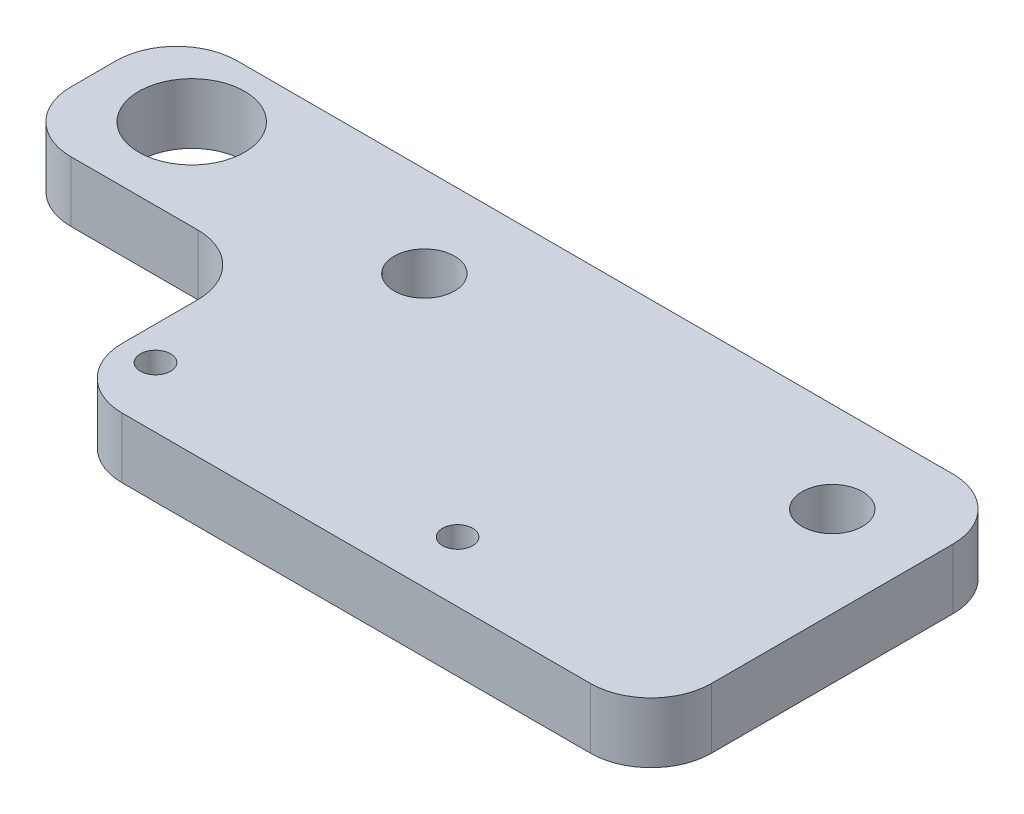
ISO-10303-21;
HEADER;
FILE_DESCRIPTION(('STEP AP214'),'2;1');
FILE_NAME('part.step','',(''),(''),'','','');
FILE_SCHEMA(('AUTOMOTIVE_DESIGN { 1 0 10303 214 1 1 1 1 }'));
ENDSEC;
DATA;
#1=APPLICATION_CONTEXT('core data for automotive mechanical design processes');
#2=APPLICATION_PROTOCOL_DEFINITION('international standard','automotive_design',2000,#1);
#3=PRODUCT_CONTEXT('',#1,'mechanical');
#4=PRODUCT('Part','Part','',(#3));
#5=PRODUCT_RELATED_PRODUCT_CATEGORY('part','',(#4));
#6=PRODUCT_DEFINITION_FORMATION('','',#4);
#7=PRODUCT_DEFINITION_CONTEXT('part definition',#1,'design');
#8=PRODUCT_DEFINITION('design','',#6,#7);
#9=PRODUCT_DEFINITION_SHAPE('','',#8);
#10=(LENGTH_UNIT() NAMED_UNIT(*) SI_UNIT(.MILLI.,.METRE.));
#11=(NAMED_UNIT(*) PLANE_ANGLE_UNIT() SI_UNIT($,.RADIAN.));
#12=(NAMED_UNIT(*) SI_UNIT($,.STERADIAN.) SOLID_ANGLE_UNIT());
#13=UNCERTAINTY_MEASURE_WITH_UNIT(LENGTH_MEASURE(1.E-05),#10,'distance_accuracy_value','');
#14=(GEOMETRIC_REPRESENTATION_CONTEXT(3) GLOBAL_UNCERTAINTY_ASSIGNED_CONTEXT((#13)) GLOBAL_UNIT_ASSIGNED_CONTEXT((#10,
#11,#12)) REPRESENTATION_CONTEXT('',''));
#15=CARTESIAN_POINT('',(0.,0.,0.));
#16=DIRECTION('',(0.,0.,1.));
#17=DIRECTION('',(1.,0.,0.));
#18=AXIS2_PLACEMENT_3D('',#15,#16,#17);
#19=CARTESIAN_POINT('',(0.,2.,0.));
#20=DIRECTION('',(0.,1.,0.));
#21=DIRECTION('',(0.,0.,1.));
#22=AXIS2_PLACEMENT_3D('',#19,#20,#21);
#23=PLANE('',#22);
#24=CARTESIAN_POINT('',(-1.76432653061225,2.,8.89754480085058));
#25=DIRECTION('',(0.,1.,0.));
#26=DIRECTION('',(0.,0.,1.));
#27=AXIS2_PLACEMENT_3D('',#24,#25,#26);
#28=CIRCLE('',#27,0.5);
#29=CARTESIAN_POINT('',(-1.76432653061225,2.,9.39754480085058));
#30=VERTEX_POINT('',#29);
#31=EDGE_CURVE('E299',#30,#30,#28,.T.);
#32=ORIENTED_EDGE('',*,*,#31,.F.);
#33=EDGE_LOOP('',(#32));
#34=FACE_BOUND('',#33,.T.);
#35=CARTESIAN_POINT('',(3.63567346938775,2.,1.89754480085059));
#36=DIRECTION('',(0.,1.,0.));
#37=DIRECTION('',(0.,0.,1.));
#38=AXIS2_PLACEMENT_3D('',#35,#36,#37);
#39=CIRCLE('',#38,0.999999999999998);
#40=CARTESIAN_POINT('',(3.63567346938775,2.,2.89754480085058));
#41=VERTEX_POINT('',#40);
#42=EDGE_CURVE('E285',#41,#41,#39,.T.);
#43=ORIENTED_EDGE('',*,*,#42,.F.);
#44=EDGE_LOOP('',(#43));
#45=FACE_BOUND('',#44,.T.);
#46=DIRECTION('',(-1.,0.,0.));
#47=VECTOR('',#46,1.);
#48=CARTESIAN_POINT('',(-12.8643265306123,2.,-1.10245519914941));
#49=LINE('',#48,#47);
#50=CARTESIAN_POINT('',(4.63567346938775,2.,-1.10245519914942));
#51=VERTEX_POINT('',#50);
#52=CARTESIAN_POINT('',(-19.0643265306122,2.,-1.10245519914941));
#53=VERTEX_POINT('',#52);
#54=EDGE_CURVE('E192',#51,#53,#49,.T.);
#55=ORIENTED_EDGE('',*,*,#54,.T.);
#56=CARTESIAN_POINT('',(-19.0643265306122,2.,0.897544800850586));
#57=DIRECTION('',(0.,1.,0.));
#58=DIRECTION('',(0.,0.,1.));
#59=AXIS2_PLACEMENT_3D('',#56,#57,#58);
#60=CIRCLE('',#59,2.);
#61=CARTESIAN_POINT('',(-21.0643265306122,2.,0.897544800850587));
#62=VERTEX_POINT('',#61);
#63=EDGE_CURVE('E221',#53,#62,#60,.T.);
#64=ORIENTED_EDGE('',*,*,#63,.T.);
#65=DIRECTION('',(0.,0.,1.));
#66=VECTOR('',#65,1.);
#67=CARTESIAN_POINT('',(-21.0643265306122,2.,-1.10245519914941));
#68=LINE('',#67,#66);
#69=CARTESIAN_POINT('',(-21.0643265306122,2.,2.39754480085059));
#70=VERTEX_POINT('',#69);
#71=EDGE_CURVE('E155',#62,#70,#68,.T.);
#72=ORIENTED_EDGE('',*,*,#71,.T.);
#73=CARTESIAN_POINT('',(-19.0643265306122,2.,2.39754480085059));
#74=DIRECTION('',(0.,1.,0.));
#75=DIRECTION('',(0.,0.,1.));
#76=AXIS2_PLACEMENT_3D('',#73,#74,#75);
#77=CIRCLE('',#76,2.);
#78=CARTESIAN_POINT('',(-19.0643265306122,2.,4.39754480085058));
#79=VERTEX_POINT('',#78);
#80=EDGE_CURVE('E218',#70,#79,#77,.T.);
#81=ORIENTED_EDGE('',*,*,#80,.T.);
#82=DIRECTION('',(1.,0.,0.));
#83=VECTOR('',#82,1.);
#84=CARTESIAN_POINT('',(-12.8643265306123,2.,4.39754480085058));
#85=LINE('',#84,#83);
#86=CARTESIAN_POINT('',(-14.8643265306123,2.,4.39754480085058));
#87=VERTEX_POINT('',#86);
#88=EDGE_CURVE('E268',#79,#87,#85,.T.);
#89=ORIENTED_EDGE('',*,*,#88,.T.);
#90=CARTESIAN_POINT('',(-14.8643265306123,2.,6.39754480085058));
#91=DIRECTION('',(0.,1.,0.));
#92=DIRECTION('',(0.,0.,1.));
#93=AXIS2_PLACEMENT_3D('',#90,#91,#92);
#94=CIRCLE('',#93,2.);
#95=CARTESIAN_POINT('',(-12.8643265306123,2.,6.39754480085058));
#96=VERTEX_POINT('',#95);
#97=EDGE_CURVE('E11',#87,#96,#94,.F.);
#98=ORIENTED_EDGE('',*,*,#97,.T.);
#99=DIRECTION('',(0.,0.,1.));
#100=VECTOR('',#99,1.);
#101=CARTESIAN_POINT('',(-12.8643265306123,2.,4.39754480085058));
#102=LINE('',#101,#100);
#103=CARTESIAN_POINT('',(-12.8643265306123,2.,8.89754480085059));
#104=VERTEX_POINT('',#103);
#105=EDGE_CURVE('E266',#96,#104,#102,.T.);
#106=ORIENTED_EDGE('',*,*,#105,.T.);
#107=CARTESIAN_POINT('',(-10.8643265306122,2.,8.89754480085059));
#108=DIRECTION('',(0.,1.,0.));
#109=DIRECTION('',(0.,0.,1.));
#110=AXIS2_PLACEMENT_3D('',#107,#108,#109);
#111=CIRCLE('',#110,2.);
#112=CARTESIAN_POINT('',(-10.8643265306122,2.,10.8975448008506));
#113=VERTEX_POINT('',#112);
#114=EDGE_CURVE('E210',#104,#113,#111,.T.);
#115=ORIENTED_EDGE('',*,*,#114,.T.);
#116=DIRECTION('',(1.,0.,0.));
#117=VECTOR('',#116,1.);
#118=CARTESIAN_POINT('',(-12.8643265306122,2.,10.8975448008506));
#119=LINE('',#118,#117);
#120=CARTESIAN_POINT('',(4.63567346938775,2.,10.8975448008506));
#121=VERTEX_POINT('',#120);
#122=EDGE_CURVE('E273',#113,#121,#119,.T.);
#123=ORIENTED_EDGE('',*,*,#122,.T.);
#124=CARTESIAN_POINT('',(4.63567346938775,2.,8.89754480085059));
#125=DIRECTION('',(0.,1.,0.));
#126=DIRECTION('',(0.,0.,1.));
#127=AXIS2_PLACEMENT_3D('',#124,#125,#126);
#128=CIRCLE('',#127,2.);
#129=CARTESIAN_POINT('',(6.63567346938775,2.,8.89754480085059));
#130=VERTEX_POINT('',#129);
#131=EDGE_CURVE('E66',#121,#130,#128,.T.);
#132=ORIENTED_EDGE('',*,*,#131,.T.);
#133=DIRECTION('',(0.,0.,-1.));
#134=VECTOR('',#133,1.);
#135=CARTESIAN_POINT('',(6.63567346938775,2.,-1.10245519914941));
#136=LINE('',#135,#134);
#137=CARTESIAN_POINT('',(6.63567346938775,2.,0.897544800850586));
#138=VERTEX_POINT('',#137);
#139=EDGE_CURVE('E176',#130,#138,#136,.T.);
#140=ORIENTED_EDGE('',*,*,#139,.T.);
#141=CARTESIAN_POINT('',(4.63567346938775,2.,0.897544800850586));
#142=DIRECTION('',(0.,1.,0.));
#143=DIRECTION('',(0.,0.,1.));
#144=AXIS2_PLACEMENT_3D('',#141,#142,#143);
#145=CIRCLE('',#144,2.);
#146=EDGE_CURVE('E215',#138,#51,#145,.T.);
#147=ORIENTED_EDGE('',*,*,#146,.T.);
#148=EDGE_LOOP('',(#55,#64,#72,#81,#89,#98,#106,#115,#123,#132,#140,#147));
#149=FACE_BOUND('',#148,.T.);
#150=CARTESIAN_POINT('',(-9.86432653061225,2.,1.89754480085059));
#151=DIRECTION('',(0.,1.,0.));
#152=DIRECTION('',(0.,0.,1.));
#153=AXIS2_PLACEMENT_3D('',#150,#151,#152);
#154=CIRCLE('',#153,1.);
#155=CARTESIAN_POINT('',(-9.86432653061225,2.,2.89754480085059));
#156=VERTEX_POINT('',#155);
#157=EDGE_CURVE('E165',#156,#156,#154,.T.);
#158=ORIENTED_EDGE('',*,*,#157,.F.);
#159=EDGE_LOOP('',(#158));
#160=FACE_BOUND('',#159,.T.);
#161=CARTESIAN_POINT('',(-11.7643265306122,2.,8.89754480085059));
#162=DIRECTION('',(0.,1.,0.));
#163=DIRECTION('',(0.,0.,1.));
#164=AXIS2_PLACEMENT_3D('',#161,#162,#163);
#165=CIRCLE('',#164,0.500000000000001);
#166=CARTESIAN_POINT('',(-11.7643265306122,2.,9.39754480085059));
#167=VERTEX_POINT('',#166);
#168=EDGE_CURVE('E291',#167,#167,#165,.T.);
#169=ORIENTED_EDGE('',*,*,#168,.F.);
#170=EDGE_LOOP('',(#169));
#171=FACE_BOUND('',#170,.T.);
#172=CARTESIAN_POINT('',(-18.0643265306123,2.,1.39754480085059));
#173=DIRECTION('',(0.,1.,0.));
#174=DIRECTION('',(0.,0.,1.));
#175=AXIS2_PLACEMENT_3D('',#172,#173,#174);
#176=CIRCLE('',#175,1.75);
#177=CARTESIAN_POINT('',(-18.0643265306123,2.,3.14754480085059));
#178=VERTEX_POINT('',#177);
#179=EDGE_CURVE('E307',#178,#178,#176,.T.);
#180=ORIENTED_EDGE('',*,*,#179,.F.);
#181=EDGE_LOOP('',(#180));
#182=FACE_BOUND('',#181,.T.);
#183=ADVANCED_FACE('F43',(#34,#45,#149,#160,#171,#182),#23,.T.);
#184=CARTESIAN_POINT('',(0.,0.,0.));
#185=DIRECTION('',(0.,1.,0.));
#186=DIRECTION('',(0.,0.,1.));
#187=AXIS2_PLACEMENT_3D('',#184,#185,#186);
#188=PLANE('',#187);
#189=DIRECTION('',(0.,0.,1.));
#190=VECTOR('',#189,1.);
#191=CARTESIAN_POINT('',(-21.0643265306122,0.,-1.10245519914941));
#192=LINE('',#191,#190);
#193=CARTESIAN_POINT('',(-21.0643265306122,0.,0.897544800850587));
#194=VERTEX_POINT('',#193);
#195=CARTESIAN_POINT('',(-21.0643265306122,0.,2.39754480085059));
#196=VERTEX_POINT('',#195);
#197=EDGE_CURVE('E152',#194,#196,#192,.T.);
#198=ORIENTED_EDGE('',*,*,#197,.F.);
#199=CARTESIAN_POINT('',(-19.0643265306122,0.,0.897544800850586));
#200=DIRECTION('',(0.,1.,0.));
#201=DIRECTION('',(0.,0.,1.));
#202=AXIS2_PLACEMENT_3D('',#199,#200,#201);
#203=CIRCLE('',#202,2.);
#204=CARTESIAN_POINT('',(-19.0643265306122,0.,-1.10245519914941));
#205=VERTEX_POINT('',#204);
#206=EDGE_CURVE('E134',#194,#205,#203,.F.);
#207=ORIENTED_EDGE('',*,*,#206,.T.);
#208=DIRECTION('',(-1.,0.,0.));
#209=VECTOR('',#208,1.);
#210=CARTESIAN_POINT('',(-12.8643265306123,0.,-1.10245519914941));
#211=LINE('',#210,#209);
#212=CARTESIAN_POINT('',(4.63567346938775,0.,-1.10245519914941));
#213=VERTEX_POINT('',#212);
#214=EDGE_CURVE('E189',#213,#205,#211,.T.);
#215=ORIENTED_EDGE('',*,*,#214,.F.);
#216=CARTESIAN_POINT('',(4.63567346938775,0.,0.897544800850586));
#217=DIRECTION('',(0.,1.,0.));
#218=DIRECTION('',(0.,0.,1.));
#219=AXIS2_PLACEMENT_3D('',#216,#217,#218);
#220=CIRCLE('',#219,2.);
#221=CARTESIAN_POINT('',(6.63567346938775,0.,0.897544800850586));
#222=VERTEX_POINT('',#221);
#223=EDGE_CURVE('E200',#213,#222,#220,.F.);
#224=ORIENTED_EDGE('',*,*,#223,.T.);
#225=DIRECTION('',(0.,0.,-1.));
#226=VECTOR('',#225,1.);
#227=CARTESIAN_POINT('',(6.63567346938775,0.,-1.10245519914941));
#228=LINE('',#227,#226);
#229=CARTESIAN_POINT('',(6.63567346938775,0.,8.89754480085059));
#230=VERTEX_POINT('',#229);
#231=EDGE_CURVE('E186',#230,#222,#228,.T.);
#232=ORIENTED_EDGE('',*,*,#231,.F.);
#233=CARTESIAN_POINT('',(4.63567346938775,0.,8.89754480085059));
#234=DIRECTION('',(0.,1.,0.));
#235=DIRECTION('',(0.,0.,1.));
#236=AXIS2_PLACEMENT_3D('',#233,#234,#235);
#237=CIRCLE('',#236,2.);
#238=CARTESIAN_POINT('',(4.63567346938775,0.,10.8975448008506));
#239=VERTEX_POINT('',#238);
#240=EDGE_CURVE('E197',#230,#239,#237,.F.);
#241=ORIENTED_EDGE('',*,*,#240,.T.);
#242=DIRECTION('',(1.,0.,0.));
#243=VECTOR('',#242,1.);
#244=CARTESIAN_POINT('',(-12.8643265306122,0.,10.8975448008506));
#245=LINE('',#244,#243);
#246=CARTESIAN_POINT('',(-10.8643265306122,0.,10.8975448008506));
#247=VERTEX_POINT('',#246);
#248=EDGE_CURVE('E182',#247,#239,#245,.T.);
#249=ORIENTED_EDGE('',*,*,#248,.F.);
#250=CARTESIAN_POINT('',(-10.8643265306122,0.,8.89754480085059));
#251=DIRECTION('',(0.,1.,0.));
#252=DIRECTION('',(0.,0.,1.));
#253=AXIS2_PLACEMENT_3D('',#250,#251,#252);
#254=CIRCLE('',#253,2.);
#255=CARTESIAN_POINT('',(-12.8643265306123,0.,8.89754480085059));
#256=VERTEX_POINT('',#255);
#257=EDGE_CURVE('E157',#247,#256,#254,.F.);
#258=ORIENTED_EDGE('',*,*,#257,.T.);
#259=DIRECTION('',(0.,0.,1.));
#260=VECTOR('',#259,1.);
#261=CARTESIAN_POINT('',(-12.8643265306123,0.,4.39754480085058));
#262=LINE('',#261,#260);
#263=CARTESIAN_POINT('',(-12.8643265306123,0.,6.39754480085058));
#264=VERTEX_POINT('',#263);
#265=EDGE_CURVE('E170',#264,#256,#262,.T.);
#266=ORIENTED_EDGE('',*,*,#265,.F.);
#267=CARTESIAN_POINT('',(-14.8643265306123,0.,6.39754480085058));
#268=DIRECTION('',(0.,1.,0.));
#269=DIRECTION('',(0.,0.,1.));
#270=AXIS2_PLACEMENT_3D('',#267,#268,#269);
#271=CIRCLE('',#270,2.);
#272=CARTESIAN_POINT('',(-14.8643265306123,0.,4.39754480085058));
#273=VERTEX_POINT('',#272);
#274=EDGE_CURVE('E52',#264,#273,#271,.T.);
#275=ORIENTED_EDGE('',*,*,#274,.T.);
#276=DIRECTION('',(1.,0.,0.));
#277=VECTOR('',#276,1.);
#278=CARTESIAN_POINT('',(-12.8643265306123,0.,4.39754480085058));
#279=LINE('',#278,#277);
#280=CARTESIAN_POINT('',(-19.0643265306122,0.,4.39754480085058));
#281=VERTEX_POINT('',#280);
#282=EDGE_CURVE('E164',#281,#273,#279,.T.);
#283=ORIENTED_EDGE('',*,*,#282,.F.);
#284=CARTESIAN_POINT('',(-19.0643265306122,0.,2.39754480085059));
#285=DIRECTION('',(0.,1.,0.));
#286=DIRECTION('',(0.,0.,1.));
#287=AXIS2_PLACEMENT_3D('',#284,#285,#286);
#288=CIRCLE('',#287,2.);
#289=EDGE_CURVE('E146',#281,#196,#288,.F.);
#290=ORIENTED_EDGE('',*,*,#289,.T.);
#291=EDGE_LOOP('',(#198,#207,#215,#224,#232,#241,#249,#258,#266,#275,#283,#290));
#292=FACE_BOUND('',#291,.T.);
#293=CARTESIAN_POINT('',(-9.86432653061225,0.,1.89754480085059));
#294=DIRECTION('',(0.,1.,0.));
#295=DIRECTION('',(0.,0.,1.));
#296=AXIS2_PLACEMENT_3D('',#293,#294,#295);
#297=CIRCLE('',#296,1.);
#298=CARTESIAN_POINT('',(-9.86432653061225,0.,2.89754480085059));
#299=VERTEX_POINT('',#298);
#300=EDGE_CURVE('E173',#299,#299,#297,.T.);
#301=ORIENTED_EDGE('',*,*,#300,.T.);
#302=EDGE_LOOP('',(#301));
#303=FACE_BOUND('',#302,.T.);
#304=CARTESIAN_POINT('',(3.63567346938775,0.,1.89754480085059));
#305=DIRECTION('',(0.,1.,0.));
#306=DIRECTION('',(0.,0.,1.));
#307=AXIS2_PLACEMENT_3D('',#304,#305,#306);
#308=CIRCLE('',#307,0.999999999999998);
#309=CARTESIAN_POINT('',(3.63567346938775,0.,2.89754480085058));
#310=VERTEX_POINT('',#309);
#311=EDGE_CURVE('E287',#310,#310,#308,.T.);
#312=ORIENTED_EDGE('',*,*,#311,.T.);
#313=EDGE_LOOP('',(#312));
#314=FACE_BOUND('',#313,.T.);
#315=CARTESIAN_POINT('',(-11.7643265306122,0.,8.89754480085059));
#316=DIRECTION('',(0.,1.,0.));
#317=DIRECTION('',(0.,0.,1.));
#318=AXIS2_PLACEMENT_3D('',#315,#316,#317);
#319=CIRCLE('',#318,0.500000000000001);
#320=CARTESIAN_POINT('',(-11.7643265306122,0.,9.39754480085059));
#321=VERTEX_POINT('',#320);
#322=EDGE_CURVE('E295',#321,#321,#319,.T.);
#323=ORIENTED_EDGE('',*,*,#322,.T.);
#324=EDGE_LOOP('',(#323));
#325=FACE_BOUND('',#324,.T.);
#326=CARTESIAN_POINT('',(-1.76432653061225,0.,8.89754480085058));
#327=DIRECTION('',(0.,1.,0.));
#328=DIRECTION('',(0.,0.,1.));
#329=AXIS2_PLACEMENT_3D('',#326,#327,#328);
#330=CIRCLE('',#329,0.5);
#331=CARTESIAN_POINT('',(-1.76432653061225,0.,9.39754480085058));
#332=VERTEX_POINT('',#331);
#333=EDGE_CURVE('E303',#332,#332,#330,.T.);
#334=ORIENTED_EDGE('',*,*,#333,.T.);
#335=EDGE_LOOP('',(#334));
#336=FACE_BOUND('',#335,.T.);
#337=CARTESIAN_POINT('',(-18.0643265306123,0.,1.39754480085059));
#338=DIRECTION('',(0.,1.,0.));
#339=DIRECTION('',(0.,0.,1.));
#340=AXIS2_PLACEMENT_3D('',#337,#338,#339);
#341=CIRCLE('',#340,1.75);
#342=CARTESIAN_POINT('',(-18.0643265306123,0.,3.14754480085059));
#343=VERTEX_POINT('',#342);
#344=EDGE_CURVE('E311',#343,#343,#341,.T.);
#345=ORIENTED_EDGE('',*,*,#344,.T.);
#346=EDGE_LOOP('',(#345));
#347=FACE_BOUND('',#346,.T.);
#348=ADVANCED_FACE('F160',(#292,#303,#314,#325,#336,#347),#188,.F.);
#349=CARTESIAN_POINT('',(-21.0643265306122,2.,-1.10245519914941));
#350=DIRECTION('',(1.,0.,0.));
#351=DIRECTION('',(0.,0.,-1.));
#352=AXIS2_PLACEMENT_3D('',#349,#350,#351);
#353=PLANE('',#352);
#354=ORIENTED_EDGE('',*,*,#71,.F.);
#355=DIRECTION('',(0.,-1.,0.));
#356=VECTOR('',#355,1.);
#357=CARTESIAN_POINT('',(-21.0643265306122,2.,0.897544800850587));
#358=LINE('',#357,#356);
#359=EDGE_CURVE('E138',#62,#194,#358,.T.);
#360=ORIENTED_EDGE('',*,*,#359,.T.);
#361=ORIENTED_EDGE('',*,*,#197,.T.);
#362=DIRECTION('',(0.,-1.,0.));
#363=VECTOR('',#362,1.);
#364=CARTESIAN_POINT('',(-21.0643265306122,2.,2.39754480085059));
#365=LINE('',#364,#363);
#366=EDGE_CURVE('E158',#196,#70,#365,.F.);
#367=ORIENTED_EDGE('',*,*,#366,.T.);
#368=EDGE_LOOP('',(#354,#360,#361,#367));
#369=FACE_BOUND('',#368,.T.);
#370=ADVANCED_FACE('F151',(#369),#353,.F.);
#371=CARTESIAN_POINT('',(-12.8643265306123,2.,4.39754480085058));
#372=DIRECTION('',(0.,0.,-1.));
#373=DIRECTION('',(-1.,0.,0.));
#374=AXIS2_PLACEMENT_3D('',#371,#372,#373);
#375=PLANE('',#374);
#376=ORIENTED_EDGE('',*,*,#88,.F.);
#377=DIRECTION('',(0.,-1.,0.));
#378=VECTOR('',#377,1.);
#379=CARTESIAN_POINT('',(-19.0643265306122,2.,4.39754480085058));
#380=LINE('',#379,#378);
#381=EDGE_CURVE('E227',#79,#281,#380,.T.);
#382=ORIENTED_EDGE('',*,*,#381,.T.);
#383=ORIENTED_EDGE('',*,*,#282,.T.);
#384=DIRECTION('',(0.,-1.,0.));
#385=VECTOR('',#384,1.);
#386=CARTESIAN_POINT('',(-14.8643265306123,2.,4.39754480085058));
#387=LINE('',#386,#385);
#388=EDGE_CURVE('E224',#273,#87,#387,.F.);
#389=ORIENTED_EDGE('',*,*,#388,.T.);
#390=EDGE_LOOP('',(#376,#382,#383,#389));
#391=FACE_BOUND('',#390,.T.);
#392=ADVANCED_FACE('F257',(#391),#375,.F.);
#393=CARTESIAN_POINT('',(-12.8643265306123,2.,4.39754480085058));
#394=DIRECTION('',(1.,0.,0.));
#395=DIRECTION('',(0.,0.,-1.));
#396=AXIS2_PLACEMENT_3D('',#393,#394,#395);
#397=PLANE('',#396);
#398=ORIENTED_EDGE('',*,*,#105,.F.);
#399=DIRECTION('',(0.,-1.,0.));
#400=VECTOR('',#399,1.);
#401=CARTESIAN_POINT('',(-12.8643265306123,0.,6.39754480085058));
#402=LINE('',#401,#400);
#403=EDGE_CURVE('E234',#96,#264,#402,.T.);
#404=ORIENTED_EDGE('',*,*,#403,.T.);
#405=ORIENTED_EDGE('',*,*,#265,.T.);
#406=DIRECTION('',(0.,-1.,0.));
#407=VECTOR('',#406,1.);
#408=CARTESIAN_POINT('',(-12.8643265306123,2.,8.89754480085059));
#409=LINE('',#408,#407);
#410=EDGE_CURVE('E231',#256,#104,#409,.F.);
#411=ORIENTED_EDGE('',*,*,#410,.T.);
#412=EDGE_LOOP('',(#398,#404,#405,#411));
#413=FACE_BOUND('',#412,.T.);
#414=ADVANCED_FACE('F270',(#413),#397,.F.);
#415=CARTESIAN_POINT('',(-12.8643265306122,2.,10.8975448008506));
#416=DIRECTION('',(0.,0.,-1.));
#417=DIRECTION('',(-1.,0.,0.));
#418=AXIS2_PLACEMENT_3D('',#415,#416,#417);
#419=PLANE('',#418);
#420=ORIENTED_EDGE('',*,*,#248,.T.);
#421=DIRECTION('',(0.,-1.,0.));
#422=VECTOR('',#421,1.);
#423=CARTESIAN_POINT('',(4.63567346938775,2.,10.8975448008506));
#424=LINE('',#423,#422);
#425=EDGE_CURVE('E248',#239,#121,#424,.F.);
#426=ORIENTED_EDGE('',*,*,#425,.T.);
#427=ORIENTED_EDGE('',*,*,#122,.F.);
#428=DIRECTION('',(0.,-1.,0.));
#429=VECTOR('',#428,1.);
#430=CARTESIAN_POINT('',(-10.8643265306122,2.,10.8975448008506));
#431=LINE('',#430,#429);
#432=EDGE_CURVE('E244',#113,#247,#431,.T.);
#433=ORIENTED_EDGE('',*,*,#432,.T.);
#434=EDGE_LOOP('',(#420,#426,#427,#433));
#435=FACE_BOUND('',#434,.T.);
#436=ADVANCED_FACE('F342',(#435),#419,.F.);
#437=CARTESIAN_POINT('',(6.63567346938775,2.,-1.10245519914941));
#438=DIRECTION('',(-1.,0.,0.));
#439=DIRECTION('',(0.,0.,1.));
#440=AXIS2_PLACEMENT_3D('',#437,#438,#439);
#441=PLANE('',#440);
#442=ORIENTED_EDGE('',*,*,#231,.T.);
#443=DIRECTION('',(0.,-1.,0.));
#444=VECTOR('',#443,1.);
#445=CARTESIAN_POINT('',(6.63567346938775,2.,0.897544800850586));
#446=LINE('',#445,#444);
#447=EDGE_CURVE('E59',#222,#138,#446,.F.);
#448=ORIENTED_EDGE('',*,*,#447,.T.);
#449=ORIENTED_EDGE('',*,*,#139,.F.);
#450=DIRECTION('',(0.,-1.,0.));
#451=VECTOR('',#450,1.);
#452=CARTESIAN_POINT('',(6.63567346938775,2.,8.89754480085059));
#453=LINE('',#452,#451);
#454=EDGE_CURVE('E238',#130,#230,#453,.T.);
#455=ORIENTED_EDGE('',*,*,#454,.T.);
#456=EDGE_LOOP('',(#442,#448,#449,#455));
#457=FACE_BOUND('',#456,.T.);
#458=ADVANCED_FACE('F338',(#457),#441,.F.);
#459=CARTESIAN_POINT('',(-12.8643265306123,2.,-1.10245519914941));
#460=DIRECTION('',(0.,0.,1.));
#461=DIRECTION('',(1.,0.,0.));
#462=AXIS2_PLACEMENT_3D('',#459,#460,#461);
#463=PLANE('',#462);
#464=ORIENTED_EDGE('',*,*,#214,.T.);
#465=DIRECTION('',(0.,-1.,0.));
#466=VECTOR('',#465,1.);
#467=CARTESIAN_POINT('',(-19.0643265306122,2.,-1.10245519914941));
#468=LINE('',#467,#466);
#469=EDGE_CURVE('E139',#205,#53,#468,.F.);
#470=ORIENTED_EDGE('',*,*,#469,.T.);
#471=ORIENTED_EDGE('',*,*,#54,.F.);
#472=DIRECTION('',(0.,-1.,0.));
#473=VECTOR('',#472,1.);
#474=CARTESIAN_POINT('',(4.63567346938775,2.,-1.10245519914941));
#475=LINE('',#474,#473);
#476=EDGE_CURVE('E145',#51,#213,#475,.T.);
#477=ORIENTED_EDGE('',*,*,#476,.T.);
#478=EDGE_LOOP('',(#464,#470,#471,#477));
#479=FACE_BOUND('',#478,.T.);
#480=ADVANCED_FACE('F335',(#479),#463,.F.);
#481=CARTESIAN_POINT('',(-9.86432653061225,2.,1.89754480085059));
#482=DIRECTION('',(0.,-1.,0.));
#483=DIRECTION('',(0.,0.,-1.));
#484=AXIS2_PLACEMENT_3D('',#481,#482,#483);
#485=CYLINDRICAL_SURFACE('',#484,1.);
#486=ORIENTED_EDGE('',*,*,#157,.T.);
#487=EDGE_LOOP('',(#486));
#488=FACE_BOUND('',#487,.T.);
#489=ORIENTED_EDGE('',*,*,#300,.F.);
#490=EDGE_LOOP('',(#489));
#491=FACE_BOUND('',#490,.T.);
#492=ADVANCED_FACE('F332',(#488,#491),#485,.F.);
#493=CARTESIAN_POINT('',(3.63567346938775,2.,1.89754480085059));
#494=DIRECTION('',(0.,-1.,0.));
#495=DIRECTION('',(0.,0.,-1.));
#496=AXIS2_PLACEMENT_3D('',#493,#494,#495);
#497=CYLINDRICAL_SURFACE('',#496,0.999999999999998);
#498=ORIENTED_EDGE('',*,*,#42,.T.);
#499=EDGE_LOOP('',(#498));
#500=FACE_BOUND('',#499,.T.);
#501=ORIENTED_EDGE('',*,*,#311,.F.);
#502=EDGE_LOOP('',(#501));
#503=FACE_BOUND('',#502,.T.);
#504=ADVANCED_FACE('F503',(#500,#503),#497,.F.);
#505=CARTESIAN_POINT('',(-11.7643265306122,2.,8.89754480085059));
#506=DIRECTION('',(0.,-1.,0.));
#507=DIRECTION('',(0.,0.,-1.));
#508=AXIS2_PLACEMENT_3D('',#505,#506,#507);
#509=CYLINDRICAL_SURFACE('',#508,0.500000000000001);
#510=ORIENTED_EDGE('',*,*,#168,.T.);
#511=EDGE_LOOP('',(#510));
#512=FACE_BOUND('',#511,.T.);
#513=ORIENTED_EDGE('',*,*,#322,.F.);
#514=EDGE_LOOP('',(#513));
#515=FACE_BOUND('',#514,.T.);
#516=ADVANCED_FACE('F492',(#512,#515),#509,.F.);
#517=CARTESIAN_POINT('',(-1.76432653061225,2.,8.89754480085058));
#518=DIRECTION('',(0.,-1.,0.));
#519=DIRECTION('',(0.,0.,-1.));
#520=AXIS2_PLACEMENT_3D('',#517,#518,#519);
#521=CYLINDRICAL_SURFACE('',#520,0.5);
#522=ORIENTED_EDGE('',*,*,#31,.T.);
#523=EDGE_LOOP('',(#522));
#524=FACE_BOUND('',#523,.T.);
#525=ORIENTED_EDGE('',*,*,#333,.F.);
#526=EDGE_LOOP('',(#525));
#527=FACE_BOUND('',#526,.T.);
#528=ADVANCED_FACE('F482',(#524,#527),#521,.F.);
#529=CARTESIAN_POINT('',(-18.0643265306123,2.,1.39754480085059));
#530=DIRECTION('',(0.,-1.,0.));
#531=DIRECTION('',(0.,0.,-1.));
#532=AXIS2_PLACEMENT_3D('',#529,#530,#531);
#533=CYLINDRICAL_SURFACE('',#532,1.75);
#534=ORIENTED_EDGE('',*,*,#179,.T.);
#535=EDGE_LOOP('',(#534));
#536=FACE_BOUND('',#535,.T.);
#537=ORIENTED_EDGE('',*,*,#344,.F.);
#538=EDGE_LOOP('',(#537));
#539=FACE_BOUND('',#538,.T.);
#540=ADVANCED_FACE('F319',(#536,#539),#533,.F.);
#541=CARTESIAN_POINT('',(-19.0643265306122,2.,0.897544800850586));
#542=DIRECTION('',(0.,-1.,0.));
#543=DIRECTION('',(0.,0.,-1.));
#544=AXIS2_PLACEMENT_3D('',#541,#542,#543);
#545=CYLINDRICAL_SURFACE('',#544,2.);
#546=ORIENTED_EDGE('',*,*,#63,.F.);
#547=ORIENTED_EDGE('',*,*,#469,.F.);
#548=ORIENTED_EDGE('',*,*,#206,.F.);
#549=ORIENTED_EDGE('',*,*,#359,.F.);
#550=EDGE_LOOP('',(#546,#547,#548,#549));
#551=FACE_BOUND('',#550,.T.);
#552=ADVANCED_FACE('F137',(#551),#545,.T.);
#553=CARTESIAN_POINT('',(-19.0643265306122,2.,2.39754480085059));
#554=DIRECTION('',(0.,-1.,0.));
#555=DIRECTION('',(0.,0.,-1.));
#556=AXIS2_PLACEMENT_3D('',#553,#554,#555);
#557=CYLINDRICAL_SURFACE('',#556,2.);
#558=ORIENTED_EDGE('',*,*,#80,.F.);
#559=ORIENTED_EDGE('',*,*,#366,.F.);
#560=ORIENTED_EDGE('',*,*,#289,.F.);
#561=ORIENTED_EDGE('',*,*,#381,.F.);
#562=EDGE_LOOP('',(#558,#559,#560,#561));
#563=FACE_BOUND('',#562,.T.);
#564=ADVANCED_FACE('F354',(#563),#557,.T.);
#565=CARTESIAN_POINT('',(-14.8643265306123,2.,6.39754480085058));
#566=DIRECTION('',(0.,1.,0.));
#567=DIRECTION('',(0.,0.,1.));
#568=AXIS2_PLACEMENT_3D('',#565,#566,#567);
#569=CYLINDRICAL_SURFACE('',#568,2.);
#570=ORIENTED_EDGE('',*,*,#97,.F.);
#571=ORIENTED_EDGE('',*,*,#388,.F.);
#572=ORIENTED_EDGE('',*,*,#274,.F.);
#573=ORIENTED_EDGE('',*,*,#403,.F.);
#574=EDGE_LOOP('',(#570,#571,#572,#573));
#575=FACE_BOUND('',#574,.T.);
#576=ADVANCED_FACE('F261',(#575),#569,.F.);
#577=CARTESIAN_POINT('',(4.63567346938775,2.,0.897544800850586));
#578=DIRECTION('',(0.,-1.,0.));
#579=DIRECTION('',(0.,0.,-1.));
#580=AXIS2_PLACEMENT_3D('',#577,#578,#579);
#581=CYLINDRICAL_SURFACE('',#580,2.);
#582=ORIENTED_EDGE('',*,*,#146,.F.);
#583=ORIENTED_EDGE('',*,*,#447,.F.);
#584=ORIENTED_EDGE('',*,*,#223,.F.);
#585=ORIENTED_EDGE('',*,*,#476,.F.);
#586=EDGE_LOOP('',(#582,#583,#584,#585));
#587=FACE_BOUND('',#586,.T.);
#588=ADVANCED_FACE('F360',(#587),#581,.T.);
#589=CARTESIAN_POINT('',(4.63567346938775,2.,8.89754480085059));
#590=DIRECTION('',(0.,-1.,0.));
#591=DIRECTION('',(0.,0.,-1.));
#592=AXIS2_PLACEMENT_3D('',#589,#590,#591);
#593=CYLINDRICAL_SURFACE('',#592,2.);
#594=ORIENTED_EDGE('',*,*,#131,.F.);
#595=ORIENTED_EDGE('',*,*,#425,.F.);
#596=ORIENTED_EDGE('',*,*,#240,.F.);
#597=ORIENTED_EDGE('',*,*,#454,.F.);
#598=EDGE_LOOP('',(#594,#595,#596,#597));
#599=FACE_BOUND('',#598,.T.);
#600=ADVANCED_FACE('F362',(#599),#593,.T.);
#601=CARTESIAN_POINT('',(-10.8643265306122,2.,8.89754480085059));
#602=DIRECTION('',(0.,-1.,0.));
#603=DIRECTION('',(0.,0.,-1.));
#604=AXIS2_PLACEMENT_3D('',#601,#602,#603);
#605=CYLINDRICAL_SURFACE('',#604,2.);
#606=ORIENTED_EDGE('',*,*,#114,.F.);
#607=ORIENTED_EDGE('',*,*,#410,.F.);
#608=ORIENTED_EDGE('',*,*,#257,.F.);
#609=ORIENTED_EDGE('',*,*,#432,.F.);
#610=EDGE_LOOP('',(#606,#607,#608,#609));
#611=FACE_BOUND('',#610,.T.);
#612=ADVANCED_FACE('F45',(#611),#605,.T.);
#613=CLOSED_SHELL('',(#183,#348,#370,#392,#414,#436,#458,#480,#492,#504,#516,#528,#540,#552,
#564,#576,#588,#600,#612));
#614=MANIFOLD_SOLID_BREP('B2',#613);
#615=ADVANCED_BREP_SHAPE_REPRESENTATION('',(#18,#614),#14);
#616=SHAPE_DEFINITION_REPRESENTATION(#9,#615);
ENDSEC;
END-ISO-10303-21;
